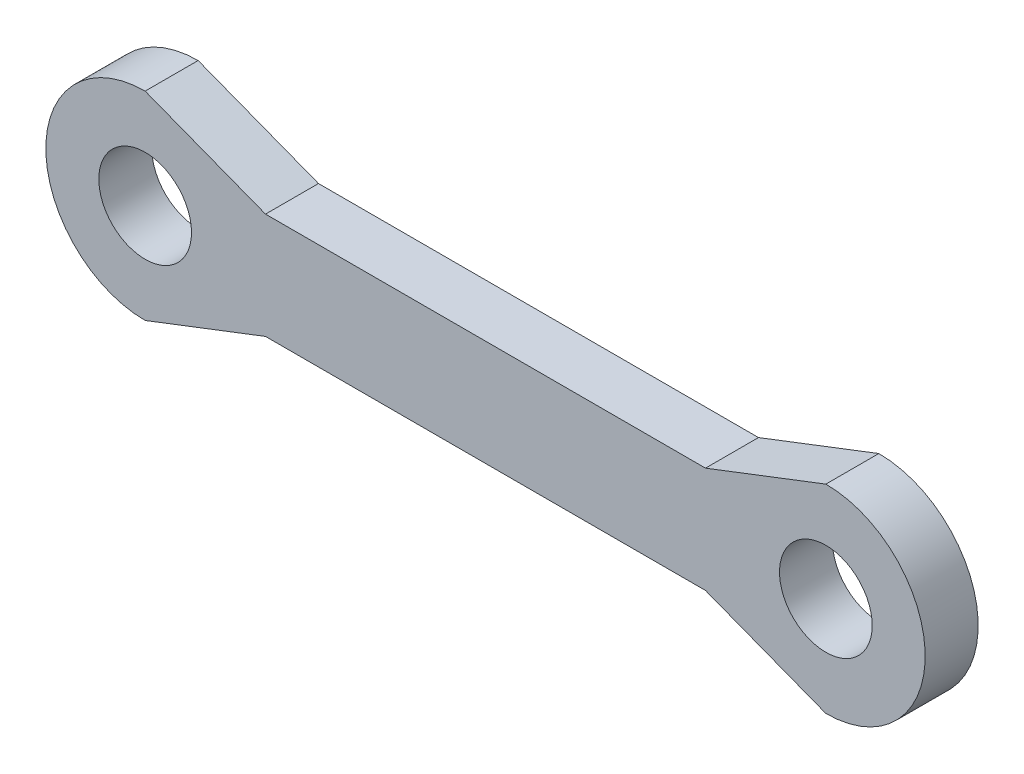
ISO-10303-21;
HEADER;
FILE_DESCRIPTION(('STEP AP214'),'2;1');
FILE_NAME('part.step','',(''),(''),'','','');
FILE_SCHEMA(('AUTOMOTIVE_DESIGN { 1 0 10303 214 1 1 1 1 }'));
ENDSEC;
DATA;
#1=APPLICATION_CONTEXT('core data for automotive mechanical design processes');
#2=APPLICATION_PROTOCOL_DEFINITION('international standard','automotive_design',2000,#1);
#3=PRODUCT_CONTEXT('',#1,'mechanical');
#4=PRODUCT('Part','Part','',(#3));
#5=PRODUCT_RELATED_PRODUCT_CATEGORY('part','',(#4));
#6=PRODUCT_DEFINITION_FORMATION('','',#4);
#7=PRODUCT_DEFINITION_CONTEXT('part definition',#1,'design');
#8=PRODUCT_DEFINITION('design','',#6,#7);
#9=PRODUCT_DEFINITION_SHAPE('','',#8);
#10=(LENGTH_UNIT() NAMED_UNIT(*) SI_UNIT(.MILLI.,.METRE.));
#11=(NAMED_UNIT(*) PLANE_ANGLE_UNIT() SI_UNIT($,.RADIAN.));
#12=(NAMED_UNIT(*) SI_UNIT($,.STERADIAN.) SOLID_ANGLE_UNIT());
#13=UNCERTAINTY_MEASURE_WITH_UNIT(LENGTH_MEASURE(1.E-05),#10,'distance_accuracy_value','');
#14=(GEOMETRIC_REPRESENTATION_CONTEXT(3) GLOBAL_UNCERTAINTY_ASSIGNED_CONTEXT((#13)) GLOBAL_UNIT_ASSIGNED_CONTEXT((#10,
#11,#12)) REPRESENTATION_CONTEXT('',''));
#15=CARTESIAN_POINT('',(0.,0.,0.));
#16=DIRECTION('',(0.,0.,1.));
#17=DIRECTION('',(1.,0.,0.));
#18=AXIS2_PLACEMENT_3D('',#15,#16,#17);
#19=CARTESIAN_POINT('',(0.,0.,4.));
#20=DIRECTION('',(0.,0.,1.));
#21=DIRECTION('',(1.,0.,0.));
#22=AXIS2_PLACEMENT_3D('',#19,#20,#21);
#23=PLANE('',#22);
#24=CARTESIAN_POINT('',(0.,0.,4.));
#25=DIRECTION('',(0.,0.,1.));
#26=DIRECTION('',(1.,0.,0.));
#27=AXIS2_PLACEMENT_3D('',#24,#25,#26);
#28=CIRCLE('',#27,3.5);
#29=CARTESIAN_POINT('',(3.5,0.,4.));
#30=VERTEX_POINT('',#29);
#31=EDGE_CURVE('E137',#30,#30,#28,.T.);
#32=ORIENTED_EDGE('',*,*,#31,.F.);
#33=EDGE_LOOP('',(#32));
#34=FACE_BOUND('',#33,.T.);
#35=DIRECTION('',(-1.,0.,0.));
#36=VECTOR('',#35,1.);
#37=CARTESIAN_POINT('',(-42.3115763086121,4.,4.));
#38=LINE('',#37,#36);
#39=CARTESIAN_POINT('',(-9.08842369138796,4.,4.));
#40=VERTEX_POINT('',#39);
#41=CARTESIAN_POINT('',(-42.3115763086121,4.,4.));
#42=VERTEX_POINT('',#41);
#43=EDGE_CURVE('E148',#40,#42,#38,.T.);
#44=ORIENTED_EDGE('',*,*,#43,.T.);
#45=DIRECTION('',(-0.933192345145633,0.359377304460915,0.));
#46=VECTOR('',#45,1.);
#47=CARTESIAN_POINT('',(-51.4,7.5,4.));
#48=LINE('',#47,#46);
#49=CARTESIAN_POINT('',(-51.4,7.5,4.));
#50=VERTEX_POINT('',#49);
#51=EDGE_CURVE('E96',#42,#50,#48,.T.);
#52=ORIENTED_EDGE('',*,*,#51,.T.);
#53=CARTESIAN_POINT('',(-51.4,0.,4.));
#54=DIRECTION('',(0.,0.,1.));
#55=DIRECTION('',(1.,0.,0.));
#56=AXIS2_PLACEMENT_3D('',#53,#54,#55);
#57=CIRCLE('',#56,7.5);
#58=CARTESIAN_POINT('',(-51.4,-7.5,4.));
#59=VERTEX_POINT('',#58);
#60=EDGE_CURVE('E163',#50,#59,#57,.T.);
#61=ORIENTED_EDGE('',*,*,#60,.T.);
#62=DIRECTION('',(0.933192345145633,0.359377304460915,0.));
#63=VECTOR('',#62,1.);
#64=CARTESIAN_POINT('',(-51.4,-7.5,4.));
#65=LINE('',#64,#63);
#66=CARTESIAN_POINT('',(-42.3115763086121,-4.,4.));
#67=VERTEX_POINT('',#66);
#68=EDGE_CURVE('E176',#59,#67,#65,.T.);
#69=ORIENTED_EDGE('',*,*,#68,.T.);
#70=DIRECTION('',(1.,0.,0.));
#71=VECTOR('',#70,1.);
#72=CARTESIAN_POINT('',(-42.3115763086121,-4.,4.));
#73=LINE('',#72,#71);
#74=CARTESIAN_POINT('',(-9.08842369138796,-4.,4.));
#75=VERTEX_POINT('',#74);
#76=EDGE_CURVE('E115',#67,#75,#73,.T.);
#77=ORIENTED_EDGE('',*,*,#76,.T.);
#78=DIRECTION('',(0.933192345145634,-0.359377304460914,0.));
#79=VECTOR('',#78,1.);
#80=CARTESIAN_POINT('',(0.,-7.5,4.));
#81=LINE('',#80,#79);
#82=CARTESIAN_POINT('',(0.,-7.5,4.));
#83=VERTEX_POINT('',#82);
#84=EDGE_CURVE('E109',#75,#83,#81,.T.);
#85=ORIENTED_EDGE('',*,*,#84,.T.);
#86=CARTESIAN_POINT('',(0.,0.,4.));
#87=DIRECTION('',(0.,0.,1.));
#88=DIRECTION('',(1.,0.,0.));
#89=AXIS2_PLACEMENT_3D('',#86,#87,#88);
#90=CIRCLE('',#89,7.5);
#91=CARTESIAN_POINT('',(0.,7.5,4.));
#92=VERTEX_POINT('',#91);
#93=EDGE_CURVE('E113',#83,#92,#90,.T.);
#94=ORIENTED_EDGE('',*,*,#93,.T.);
#95=DIRECTION('',(-0.933192345145634,-0.359377304460914,0.));
#96=VECTOR('',#95,1.);
#97=CARTESIAN_POINT('',(0.,7.5,4.));
#98=LINE('',#97,#96);
#99=EDGE_CURVE('E53',#92,#40,#98,.T.);
#100=ORIENTED_EDGE('',*,*,#99,.T.);
#101=EDGE_LOOP('',(#44,#52,#61,#69,#77,#85,#94,#100));
#102=FACE_BOUND('',#101,.T.);
#103=CARTESIAN_POINT('',(-51.4,0.,4.));
#104=DIRECTION('',(0.,0.,1.));
#105=DIRECTION('',(1.,0.,0.));
#106=AXIS2_PLACEMENT_3D('',#103,#104,#105);
#107=CIRCLE('',#106,3.5);
#108=CARTESIAN_POINT('',(-47.9,0.,4.));
#109=VERTEX_POINT('',#108);
#110=EDGE_CURVE('E185',#109,#109,#107,.T.);
#111=ORIENTED_EDGE('',*,*,#110,.F.);
#112=EDGE_LOOP('',(#111));
#113=FACE_BOUND('',#112,.T.);
#114=ADVANCED_FACE('F36',(#34,#102,#113),#23,.T.);
#115=CARTESIAN_POINT('',(0.,0.,0.));
#116=DIRECTION('',(0.,0.,1.));
#117=DIRECTION('',(1.,0.,0.));
#118=AXIS2_PLACEMENT_3D('',#115,#116,#117);
#119=PLANE('',#118);
#120=DIRECTION('',(-1.,0.,0.));
#121=VECTOR('',#120,1.);
#122=CARTESIAN_POINT('',(-42.3115763086121,4.,0.));
#123=LINE('',#122,#121);
#124=CARTESIAN_POINT('',(-9.08842369138796,4.,0.));
#125=VERTEX_POINT('',#124);
#126=CARTESIAN_POINT('',(-42.3115763086121,4.,0.));
#127=VERTEX_POINT('',#126);
#128=EDGE_CURVE('E133',#125,#127,#123,.T.);
#129=ORIENTED_EDGE('',*,*,#128,.F.);
#130=DIRECTION('',(-0.933192345145634,-0.359377304460914,0.));
#131=VECTOR('',#130,1.);
#132=CARTESIAN_POINT('',(0.,7.5,0.));
#133=LINE('',#132,#131);
#134=CARTESIAN_POINT('',(0.,7.5,0.));
#135=VERTEX_POINT('',#134);
#136=EDGE_CURVE('E88',#135,#125,#133,.T.);
#137=ORIENTED_EDGE('',*,*,#136,.F.);
#138=CARTESIAN_POINT('',(0.,0.,0.));
#139=DIRECTION('',(0.,0.,1.));
#140=DIRECTION('',(1.,0.,0.));
#141=AXIS2_PLACEMENT_3D('',#138,#139,#140);
#142=CIRCLE('',#141,7.5);
#143=CARTESIAN_POINT('',(0.,-7.5,0.));
#144=VERTEX_POINT('',#143);
#145=EDGE_CURVE('E82',#144,#135,#142,.T.);
#146=ORIENTED_EDGE('',*,*,#145,.F.);
#147=DIRECTION('',(0.933192345145634,-0.359377304460914,0.));
#148=VECTOR('',#147,1.);
#149=CARTESIAN_POINT('',(0.,-7.5,0.));
#150=LINE('',#149,#148);
#151=CARTESIAN_POINT('',(-9.08842369138796,-4.,0.));
#152=VERTEX_POINT('',#151);
#153=EDGE_CURVE('E123',#152,#144,#150,.T.);
#154=ORIENTED_EDGE('',*,*,#153,.F.);
#155=DIRECTION('',(1.,0.,0.));
#156=VECTOR('',#155,1.);
#157=CARTESIAN_POINT('',(-42.3115763086121,-4.,0.));
#158=LINE('',#157,#156);
#159=CARTESIAN_POINT('',(-42.3115763086121,-4.,0.));
#160=VERTEX_POINT('',#159);
#161=EDGE_CURVE('E143',#160,#152,#158,.T.);
#162=ORIENTED_EDGE('',*,*,#161,.F.);
#163=DIRECTION('',(0.933192345145633,0.359377304460915,0.));
#164=VECTOR('',#163,1.);
#165=CARTESIAN_POINT('',(-51.4,-7.5,0.));
#166=LINE('',#165,#164);
#167=CARTESIAN_POINT('',(-51.4,-7.5,0.));
#168=VERTEX_POINT('',#167);
#169=EDGE_CURVE('E141',#168,#160,#166,.T.);
#170=ORIENTED_EDGE('',*,*,#169,.F.);
#171=CARTESIAN_POINT('',(-51.4,0.,0.));
#172=DIRECTION('',(0.,0.,1.));
#173=DIRECTION('',(1.,0.,0.));
#174=AXIS2_PLACEMENT_3D('',#171,#172,#173);
#175=CIRCLE('',#174,7.5);
#176=CARTESIAN_POINT('',(-51.4,7.5,0.));
#177=VERTEX_POINT('',#176);
#178=EDGE_CURVE('E139',#177,#168,#175,.T.);
#179=ORIENTED_EDGE('',*,*,#178,.F.);
#180=DIRECTION('',(-0.933192345145633,0.359377304460915,0.));
#181=VECTOR('',#180,1.);
#182=CARTESIAN_POINT('',(-51.4,7.5,0.));
#183=LINE('',#182,#181);
#184=EDGE_CURVE('E136',#127,#177,#183,.T.);
#185=ORIENTED_EDGE('',*,*,#184,.F.);
#186=EDGE_LOOP('',(#129,#137,#146,#154,#162,#170,#179,#185));
#187=FACE_BOUND('',#186,.T.);
#188=CARTESIAN_POINT('',(0.,0.,0.));
#189=DIRECTION('',(0.,0.,1.));
#190=DIRECTION('',(1.,0.,0.));
#191=AXIS2_PLACEMENT_3D('',#188,#189,#190);
#192=CIRCLE('',#191,3.5);
#193=CARTESIAN_POINT('',(3.5,0.,0.));
#194=VERTEX_POINT('',#193);
#195=EDGE_CURVE('E182',#194,#194,#192,.T.);
#196=ORIENTED_EDGE('',*,*,#195,.T.);
#197=EDGE_LOOP('',(#196));
#198=FACE_BOUND('',#197,.T.);
#199=CARTESIAN_POINT('',(-51.4,0.,0.));
#200=DIRECTION('',(0.,0.,1.));
#201=DIRECTION('',(1.,0.,0.));
#202=AXIS2_PLACEMENT_3D('',#199,#200,#201);
#203=CIRCLE('',#202,3.5);
#204=CARTESIAN_POINT('',(-47.9,0.,0.));
#205=VERTEX_POINT('',#204);
#206=EDGE_CURVE('E188',#205,#205,#203,.T.);
#207=ORIENTED_EDGE('',*,*,#206,.T.);
#208=EDGE_LOOP('',(#207));
#209=FACE_BOUND('',#208,.T.);
#210=ADVANCED_FACE('F167',(#187,#198,#209),#119,.F.);
#211=CARTESIAN_POINT('',(-42.3115763086121,4.,4.));
#212=DIRECTION('',(0.,-1.,0.));
#213=DIRECTION('',(0.,0.,-1.));
#214=AXIS2_PLACEMENT_3D('',#211,#212,#213);
#215=PLANE('',#214);
#216=ORIENTED_EDGE('',*,*,#128,.T.);
#217=DIRECTION('',(0.,0.,-1.));
#218=VECTOR('',#217,1.);
#219=CARTESIAN_POINT('',(-42.3115763086121,4.,4.));
#220=LINE('',#219,#218);
#221=EDGE_CURVE('E11',#42,#127,#220,.T.);
#222=ORIENTED_EDGE('',*,*,#221,.F.);
#223=ORIENTED_EDGE('',*,*,#43,.F.);
#224=DIRECTION('',(0.,0.,-1.));
#225=VECTOR('',#224,1.);
#226=CARTESIAN_POINT('',(-9.08842369138796,4.,4.));
#227=LINE('',#226,#225);
#228=EDGE_CURVE('E129',#40,#125,#227,.T.);
#229=ORIENTED_EDGE('',*,*,#228,.T.);
#230=EDGE_LOOP('',(#216,#222,#223,#229));
#231=FACE_BOUND('',#230,.T.);
#232=ADVANCED_FACE('F38',(#231),#215,.F.);
#233=CARTESIAN_POINT('',(-51.4,7.5,4.));
#234=DIRECTION('',(-0.359377304460915,-0.933192345145634,0.));
#235=DIRECTION('',(0.933192345145633,-0.359377304460915,0.));
#236=AXIS2_PLACEMENT_3D('',#233,#234,#235);
#237=PLANE('',#236);
#238=ORIENTED_EDGE('',*,*,#184,.T.);
#239=DIRECTION('',(0.,0.,-1.));
#240=VECTOR('',#239,1.);
#241=CARTESIAN_POINT('',(-51.4,7.5,4.));
#242=LINE('',#241,#240);
#243=EDGE_CURVE('E45',#50,#177,#242,.T.);
#244=ORIENTED_EDGE('',*,*,#243,.F.);
#245=ORIENTED_EDGE('',*,*,#51,.F.);
#246=ORIENTED_EDGE('',*,*,#221,.T.);
#247=EDGE_LOOP('',(#238,#244,#245,#246));
#248=FACE_BOUND('',#247,.T.);
#249=ADVANCED_FACE('F220',(#248),#237,.F.);
#250=CARTESIAN_POINT('',(-51.4,0.,4.));
#251=DIRECTION('',(0.,0.,-1.));
#252=DIRECTION('',(-1.,0.,0.));
#253=AXIS2_PLACEMENT_3D('',#250,#251,#252);
#254=CYLINDRICAL_SURFACE('',#253,7.5);
#255=ORIENTED_EDGE('',*,*,#178,.T.);
#256=DIRECTION('',(0.,0.,-1.));
#257=VECTOR('',#256,1.);
#258=CARTESIAN_POINT('',(-51.4,-7.5,4.));
#259=LINE('',#258,#257);
#260=EDGE_CURVE('E155',#59,#168,#259,.T.);
#261=ORIENTED_EDGE('',*,*,#260,.F.);
#262=ORIENTED_EDGE('',*,*,#60,.F.);
#263=ORIENTED_EDGE('',*,*,#243,.T.);
#264=EDGE_LOOP('',(#255,#261,#262,#263));
#265=FACE_BOUND('',#264,.T.);
#266=ADVANCED_FACE('F161',(#265),#254,.T.);
#267=CARTESIAN_POINT('',(-51.4,-7.5,4.));
#268=DIRECTION('',(-0.359377304460915,0.933192345145634,0.));
#269=DIRECTION('',(-0.933192345145633,-0.359377304460915,0.));
#270=AXIS2_PLACEMENT_3D('',#267,#268,#269);
#271=PLANE('',#270);
#272=ORIENTED_EDGE('',*,*,#169,.T.);
#273=DIRECTION('',(0.,0.,-1.));
#274=VECTOR('',#273,1.);
#275=CARTESIAN_POINT('',(-42.3115763086121,-4.,4.));
#276=LINE('',#275,#274);
#277=EDGE_CURVE('E152',#67,#160,#276,.T.);
#278=ORIENTED_EDGE('',*,*,#277,.F.);
#279=ORIENTED_EDGE('',*,*,#68,.F.);
#280=ORIENTED_EDGE('',*,*,#260,.T.);
#281=EDGE_LOOP('',(#272,#278,#279,#280));
#282=FACE_BOUND('',#281,.T.);
#283=ADVANCED_FACE('F172',(#282),#271,.F.);
#284=CARTESIAN_POINT('',(-42.3115763086121,-4.,4.));
#285=DIRECTION('',(0.,1.,0.));
#286=DIRECTION('',(0.,0.,1.));
#287=AXIS2_PLACEMENT_3D('',#284,#285,#286);
#288=PLANE('',#287);
#289=ORIENTED_EDGE('',*,*,#161,.T.);
#290=DIRECTION('',(0.,0.,-1.));
#291=VECTOR('',#290,1.);
#292=CARTESIAN_POINT('',(-9.08842369138796,-4.,4.));
#293=LINE('',#292,#291);
#294=EDGE_CURVE('E124',#75,#152,#293,.T.);
#295=ORIENTED_EDGE('',*,*,#294,.F.);
#296=ORIENTED_EDGE('',*,*,#76,.F.);
#297=ORIENTED_EDGE('',*,*,#277,.T.);
#298=EDGE_LOOP('',(#289,#295,#296,#297));
#299=FACE_BOUND('',#298,.T.);
#300=ADVANCED_FACE('F175',(#299),#288,.F.);
#301=CARTESIAN_POINT('',(0.,-7.5,4.));
#302=DIRECTION('',(0.359377304460914,0.933192345145634,0.));
#303=DIRECTION('',(-0.933192345145634,0.359377304460914,0.));
#304=AXIS2_PLACEMENT_3D('',#301,#302,#303);
#305=PLANE('',#304);
#306=ORIENTED_EDGE('',*,*,#153,.T.);
#307=DIRECTION('',(0.,0.,-1.));
#308=VECTOR('',#307,1.);
#309=CARTESIAN_POINT('',(0.,-7.5,4.));
#310=LINE('',#309,#308);
#311=EDGE_CURVE('E120',#83,#144,#310,.T.);
#312=ORIENTED_EDGE('',*,*,#311,.F.);
#313=ORIENTED_EDGE('',*,*,#84,.F.);
#314=ORIENTED_EDGE('',*,*,#294,.T.);
#315=EDGE_LOOP('',(#306,#312,#313,#314));
#316=FACE_BOUND('',#315,.T.);
#317=ADVANCED_FACE('F121',(#316),#305,.F.);
#318=CARTESIAN_POINT('',(0.,0.,4.));
#319=DIRECTION('',(0.,0.,-1.));
#320=DIRECTION('',(-1.,0.,0.));
#321=AXIS2_PLACEMENT_3D('',#318,#319,#320);
#322=CYLINDRICAL_SURFACE('',#321,7.5);
#323=ORIENTED_EDGE('',*,*,#145,.T.);
#324=DIRECTION('',(0.,0.,-1.));
#325=VECTOR('',#324,1.);
#326=CARTESIAN_POINT('',(0.,7.5,4.));
#327=LINE('',#326,#325);
#328=EDGE_CURVE('E125',#92,#135,#327,.T.);
#329=ORIENTED_EDGE('',*,*,#328,.F.);
#330=ORIENTED_EDGE('',*,*,#93,.F.);
#331=ORIENTED_EDGE('',*,*,#311,.T.);
#332=EDGE_LOOP('',(#323,#329,#330,#331));
#333=FACE_BOUND('',#332,.T.);
#334=ADVANCED_FACE('F127',(#333),#322,.T.);
#335=CARTESIAN_POINT('',(0.,7.5,4.));
#336=DIRECTION('',(0.359377304460914,-0.933192345145634,0.));
#337=DIRECTION('',(0.933192345145634,0.359377304460914,0.));
#338=AXIS2_PLACEMENT_3D('',#335,#336,#337);
#339=PLANE('',#338);
#340=ORIENTED_EDGE('',*,*,#136,.T.);
#341=ORIENTED_EDGE('',*,*,#228,.F.);
#342=ORIENTED_EDGE('',*,*,#99,.F.);
#343=ORIENTED_EDGE('',*,*,#328,.T.);
#344=EDGE_LOOP('',(#340,#341,#342,#343));
#345=FACE_BOUND('',#344,.T.);
#346=ADVANCED_FACE('F208',(#345),#339,.F.);
#347=CARTESIAN_POINT('',(0.,0.,4.));
#348=DIRECTION('',(0.,0.,-1.));
#349=DIRECTION('',(-1.,0.,0.));
#350=AXIS2_PLACEMENT_3D('',#347,#348,#349);
#351=CYLINDRICAL_SURFACE('',#350,3.5);
#352=ORIENTED_EDGE('',*,*,#31,.T.);
#353=EDGE_LOOP('',(#352));
#354=FACE_BOUND('',#353,.T.);
#355=ORIENTED_EDGE('',*,*,#195,.F.);
#356=EDGE_LOOP('',(#355));
#357=FACE_BOUND('',#356,.T.);
#358=ADVANCED_FACE('F205',(#354,#357),#351,.F.);
#359=CARTESIAN_POINT('',(-51.4,0.,4.));
#360=DIRECTION('',(0.,0.,-1.));
#361=DIRECTION('',(-1.,0.,0.));
#362=AXIS2_PLACEMENT_3D('',#359,#360,#361);
#363=CYLINDRICAL_SURFACE('',#362,3.5);
#364=ORIENTED_EDGE('',*,*,#110,.T.);
#365=EDGE_LOOP('',(#364));
#366=FACE_BOUND('',#365,.T.);
#367=ORIENTED_EDGE('',*,*,#206,.F.);
#368=EDGE_LOOP('',(#367));
#369=FACE_BOUND('',#368,.T.);
#370=ADVANCED_FACE('F194',(#366,#369),#363,.F.);
#371=CLOSED_SHELL('',(#114,#210,#232,#249,#266,#283,#300,#317,#334,#346,#358,#370));
#372=MANIFOLD_SOLID_BREP('B2',#371);
#373=ADVANCED_BREP_SHAPE_REPRESENTATION('',(#18,#372),#14);
#374=SHAPE_DEFINITION_REPRESENTATION(#9,#373);
ENDSEC;
END-ISO-10303-21;
